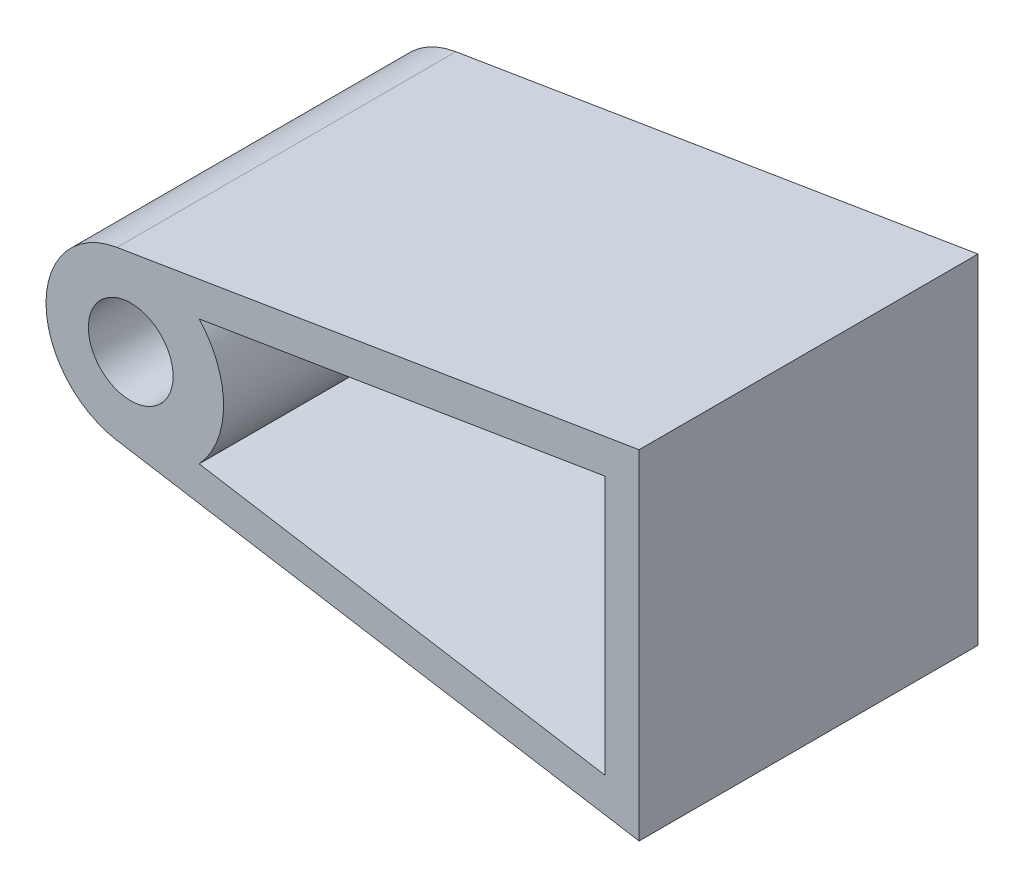
ISO-10303-21;
HEADER;
FILE_DESCRIPTION(('STEP AP214'),'2;1');
FILE_NAME('part.step','',(''),(''),'','','');
FILE_SCHEMA(('AUTOMOTIVE_DESIGN { 1 0 10303 214 1 1 1 1 }'));
ENDSEC;
DATA;
#1=APPLICATION_CONTEXT('core data for automotive mechanical design processes');
#2=APPLICATION_PROTOCOL_DEFINITION('international standard','automotive_design',2000,#1);
#3=PRODUCT_CONTEXT('',#1,'mechanical');
#4=PRODUCT('Part','Part','',(#3));
#5=PRODUCT_RELATED_PRODUCT_CATEGORY('part','',(#4));
#6=PRODUCT_DEFINITION_FORMATION('','',#4);
#7=PRODUCT_DEFINITION_CONTEXT('part definition',#1,'design');
#8=PRODUCT_DEFINITION('design','',#6,#7);
#9=PRODUCT_DEFINITION_SHAPE('','',#8);
#10=(LENGTH_UNIT() NAMED_UNIT(*) SI_UNIT(.MILLI.,.METRE.));
#11=(NAMED_UNIT(*) PLANE_ANGLE_UNIT() SI_UNIT($,.RADIAN.));
#12=(NAMED_UNIT(*) SI_UNIT($,.STERADIAN.) SOLID_ANGLE_UNIT());
#13=UNCERTAINTY_MEASURE_WITH_UNIT(LENGTH_MEASURE(1.E-05),#10,'distance_accuracy_value','');
#14=(GEOMETRIC_REPRESENTATION_CONTEXT(3) GLOBAL_UNCERTAINTY_ASSIGNED_CONTEXT((#13)) GLOBAL_UNIT_ASSIGNED_CONTEXT((#10,
#11,#12)) REPRESENTATION_CONTEXT('',''));
#15=CARTESIAN_POINT('',(0.,0.,0.));
#16=DIRECTION('',(0.,0.,1.));
#17=DIRECTION('',(1.,0.,0.));
#18=AXIS2_PLACEMENT_3D('',#15,#16,#17);
#19=CARTESIAN_POINT('',(-30.,0.,10.));
#20=DIRECTION('',(0.,0.,1.));
#21=DIRECTION('',(1.,0.,0.));
#22=AXIS2_PLACEMENT_3D('',#19,#20,#21);
#23=PLANE('',#22);
#24=CARTESIAN_POINT('',(-30.,0.,10.));
#25=DIRECTION('',(0.,0.,-1.));
#26=DIRECTION('',(1.,0.,0.));
#27=AXIS2_PLACEMENT_3D('',#24,#25,#26);
#28=CIRCLE('',#27,5.48071976405732);
#29=CARTESIAN_POINT('',(-25.9607740547666,3.7044490677403,10.));
#30=VERTEX_POINT('',#29);
#31=CARTESIAN_POINT('',(-25.9607740547666,-3.7044490677403,10.));
#32=VERTEX_POINT('',#31);
#33=EDGE_CURVE('E54',#30,#32,#28,.T.);
#34=ORIENTED_EDGE('',*,*,#33,.F.);
#35=DIRECTION('',(-0.98674969975976,-0.16224989991992,0.));
#36=VECTOR('',#35,1.);
#37=CARTESIAN_POINT('',(-2.,7.64428628617189,10.));
#38=LINE('',#37,#36);
#39=CARTESIAN_POINT('',(-2.,7.64428628617189,10.));
#40=VERTEX_POINT('',#39);
#41=EDGE_CURVE('E125',#40,#30,#38,.T.);
#42=ORIENTED_EDGE('',*,*,#41,.F.);
#43=DIRECTION('',(0.,1.,0.));
#44=VECTOR('',#43,1.);
#45=CARTESIAN_POINT('',(-2.,-7.64428628617189,10.));
#46=LINE('',#45,#44);
#47=CARTESIAN_POINT('',(-2.,-7.64428628617189,10.));
#48=VERTEX_POINT('',#47);
#49=EDGE_CURVE('E129',#48,#40,#46,.T.);
#50=ORIENTED_EDGE('',*,*,#49,.F.);
#51=DIRECTION('',(0.98674969975976,-0.16224989991992,0.));
#52=VECTOR('',#51,1.);
#53=CARTESIAN_POINT('',(-25.9607740547666,-3.7044490677403,10.));
#54=LINE('',#53,#52);
#55=EDGE_CURVE('E138',#32,#48,#54,.T.);
#56=ORIENTED_EDGE('',*,*,#55,.F.);
#57=EDGE_LOOP('',(#34,#42,#50,#56));
#58=FACE_BOUND('',#57,.T.);
#59=DIRECTION('',(0.98674969975976,-0.16224989991992,0.));
#60=VECTOR('',#59,1.);
#61=CARTESIAN_POINT('',(0.,-10.,10.));
#62=LINE('',#61,#60);
#63=CARTESIAN_POINT('',(-30.8112494995996,-4.9337484987988,10.));
#64=VERTEX_POINT('',#63);
#65=CARTESIAN_POINT('',(0.,-10.,10.));
#66=VERTEX_POINT('',#65);
#67=EDGE_CURVE('E161',#64,#66,#62,.T.);
#68=ORIENTED_EDGE('',*,*,#67,.T.);
#69=DIRECTION('',(0.,1.,0.));
#70=VECTOR('',#69,1.);
#71=CARTESIAN_POINT('',(0.,10.,10.));
#72=LINE('',#71,#70);
#73=CARTESIAN_POINT('',(0.,10.,10.));
#74=VERTEX_POINT('',#73);
#75=EDGE_CURVE('E165',#66,#74,#72,.T.);
#76=ORIENTED_EDGE('',*,*,#75,.T.);
#77=DIRECTION('',(-0.98674969975976,-0.16224989991992,0.));
#78=VECTOR('',#77,1.);
#79=CARTESIAN_POINT('',(0.,10.,10.));
#80=LINE('',#79,#78);
#81=CARTESIAN_POINT('',(-30.8112494995996,4.9337484987988,10.));
#82=VERTEX_POINT('',#81);
#83=EDGE_CURVE('E169',#74,#82,#80,.T.);
#84=ORIENTED_EDGE('',*,*,#83,.T.);
#85=CARTESIAN_POINT('',(-30.,0.,10.));
#86=DIRECTION('',(0.,0.,1.));
#87=DIRECTION('',(1.,0.,0.));
#88=AXIS2_PLACEMENT_3D('',#85,#86,#87);
#89=CIRCLE('',#88,5.);
#90=EDGE_CURVE('E172',#82,#64,#89,.T.);
#91=ORIENTED_EDGE('',*,*,#90,.T.);
#92=EDGE_LOOP('',(#68,#76,#84,#91));
#93=FACE_BOUND('',#92,.T.);
#94=CARTESIAN_POINT('',(-30.,0.,10.));
#95=DIRECTION('',(0.,0.,1.));
#96=DIRECTION('',(1.,0.,0.));
#97=AXIS2_PLACEMENT_3D('',#94,#95,#96);
#98=CIRCLE('',#97,2.5);
#99=CARTESIAN_POINT('',(-27.5,0.,10.));
#100=VERTEX_POINT('',#99);
#101=EDGE_CURVE('E153',#100,#100,#98,.T.);
#102=ORIENTED_EDGE('',*,*,#101,.F.);
#103=EDGE_LOOP('',(#102));
#104=FACE_BOUND('',#103,.T.);
#105=ADVANCED_FACE('F38',(#58,#93,#104),#23,.T.);
#106=CARTESIAN_POINT('',(-30.,0.,-10.));
#107=DIRECTION('',(0.,0.,1.));
#108=DIRECTION('',(1.,0.,0.));
#109=AXIS2_PLACEMENT_3D('',#106,#107,#108);
#110=PLANE('',#109);
#111=DIRECTION('',(-0.98674969975976,-0.16224989991992,0.));
#112=VECTOR('',#111,1.);
#113=CARTESIAN_POINT('',(-2.,7.64428628617189,-10.));
#114=LINE('',#113,#112);
#115=CARTESIAN_POINT('',(-2.,7.64428628617189,-10.));
#116=VERTEX_POINT('',#115);
#117=CARTESIAN_POINT('',(-25.9607740547666,3.7044490677403,-10.));
#118=VERTEX_POINT('',#117);
#119=EDGE_CURVE('E113',#116,#118,#114,.T.);
#120=ORIENTED_EDGE('',*,*,#119,.T.);
#121=CARTESIAN_POINT('',(-30.,0.,-10.));
#122=DIRECTION('',(0.,0.,-1.));
#123=DIRECTION('',(1.,0.,0.));
#124=AXIS2_PLACEMENT_3D('',#121,#122,#123);
#125=CIRCLE('',#124,5.48071976405732);
#126=CARTESIAN_POINT('',(-25.9607740547666,-3.7044490677403,-10.));
#127=VERTEX_POINT('',#126);
#128=EDGE_CURVE('E106',#118,#127,#125,.T.);
#129=ORIENTED_EDGE('',*,*,#128,.T.);
#130=DIRECTION('',(0.98674969975976,-0.16224989991992,0.));
#131=VECTOR('',#130,1.);
#132=CARTESIAN_POINT('',(-25.9607740547666,-3.7044490677403,-10.));
#133=LINE('',#132,#131);
#134=CARTESIAN_POINT('',(-2.,-7.64428628617188,-10.));
#135=VERTEX_POINT('',#134);
#136=EDGE_CURVE('E116',#127,#135,#133,.T.);
#137=ORIENTED_EDGE('',*,*,#136,.T.);
#138=DIRECTION('',(0.,1.,0.));
#139=VECTOR('',#138,1.);
#140=CARTESIAN_POINT('',(-2.,-7.64428628617189,-10.));
#141=LINE('',#140,#139);
#142=EDGE_CURVE('E62',#135,#116,#141,.T.);
#143=ORIENTED_EDGE('',*,*,#142,.T.);
#144=EDGE_LOOP('',(#120,#129,#137,#143));
#145=FACE_BOUND('',#144,.T.);
#146=DIRECTION('',(0.98674969975976,-0.16224989991992,0.));
#147=VECTOR('',#146,1.);
#148=CARTESIAN_POINT('',(0.,-10.,-10.));
#149=LINE('',#148,#147);
#150=CARTESIAN_POINT('',(-30.8112494995996,-4.9337484987988,-10.));
#151=VERTEX_POINT('',#150);
#152=CARTESIAN_POINT('',(0.,-10.,-10.));
#153=VERTEX_POINT('',#152);
#154=EDGE_CURVE('E157',#151,#153,#149,.T.);
#155=ORIENTED_EDGE('',*,*,#154,.F.);
#156=CARTESIAN_POINT('',(-30.,0.,-10.));
#157=DIRECTION('',(0.,0.,1.));
#158=DIRECTION('',(1.,0.,0.));
#159=AXIS2_PLACEMENT_3D('',#156,#157,#158);
#160=CIRCLE('',#159,5.);
#161=CARTESIAN_POINT('',(-30.8112494995996,4.9337484987988,-10.));
#162=VERTEX_POINT('',#161);
#163=EDGE_CURVE('E166',#162,#151,#160,.T.);
#164=ORIENTED_EDGE('',*,*,#163,.F.);
#165=DIRECTION('',(-0.98674969975976,-0.16224989991992,0.));
#166=VECTOR('',#165,1.);
#167=CARTESIAN_POINT('',(0.,10.,-10.));
#168=LINE('',#167,#166);
#169=CARTESIAN_POINT('',(0.,10.,-10.));
#170=VERTEX_POINT('',#169);
#171=EDGE_CURVE('E182',#170,#162,#168,.T.);
#172=ORIENTED_EDGE('',*,*,#171,.F.);
#173=DIRECTION('',(0.,1.,0.));
#174=VECTOR('',#173,1.);
#175=CARTESIAN_POINT('',(0.,10.,-10.));
#176=LINE('',#175,#174);
#177=EDGE_CURVE('E179',#153,#170,#176,.T.);
#178=ORIENTED_EDGE('',*,*,#177,.F.);
#179=EDGE_LOOP('',(#155,#164,#172,#178));
#180=FACE_BOUND('',#179,.T.);
#181=CARTESIAN_POINT('',(-30.,0.,-10.));
#182=DIRECTION('',(0.,0.,1.));
#183=DIRECTION('',(1.,0.,0.));
#184=AXIS2_PLACEMENT_3D('',#181,#182,#183);
#185=CIRCLE('',#184,2.5);
#186=CARTESIAN_POINT('',(-27.5,0.,-10.));
#187=VERTEX_POINT('',#186);
#188=EDGE_CURVE('E147',#187,#187,#185,.T.);
#189=ORIENTED_EDGE('',*,*,#188,.T.);
#190=EDGE_LOOP('',(#189));
#191=FACE_BOUND('',#190,.T.);
#192=ADVANCED_FACE('F121',(#145,#180,#191),#110,.F.);
#193=CARTESIAN_POINT('',(0.,-10.,10.));
#194=DIRECTION('',(0.16224989991992,0.98674969975976,0.));
#195=DIRECTION('',(-0.98674969975976,0.16224989991992,0.));
#196=AXIS2_PLACEMENT_3D('',#193,#194,#195);
#197=PLANE('',#196);
#198=ORIENTED_EDGE('',*,*,#154,.T.);
#199=DIRECTION('',(0.,0.,-1.));
#200=VECTOR('',#199,1.);
#201=CARTESIAN_POINT('',(0.,-10.,10.));
#202=LINE('',#201,#200);
#203=EDGE_CURVE('E11',#66,#153,#202,.T.);
#204=ORIENTED_EDGE('',*,*,#203,.F.);
#205=ORIENTED_EDGE('',*,*,#67,.F.);
#206=DIRECTION('',(0.,0.,-1.));
#207=VECTOR('',#206,1.);
#208=CARTESIAN_POINT('',(-30.8112494995996,-4.9337484987988,10.));
#209=LINE('',#208,#207);
#210=EDGE_CURVE('E175',#64,#151,#209,.T.);
#211=ORIENTED_EDGE('',*,*,#210,.T.);
#212=EDGE_LOOP('',(#198,#204,#205,#211));
#213=FACE_BOUND('',#212,.T.);
#214=ADVANCED_FACE('F40',(#213),#197,.F.);
#215=CARTESIAN_POINT('',(0.,10.,10.));
#216=DIRECTION('',(-1.,0.,0.));
#217=DIRECTION('',(0.,0.,1.));
#218=AXIS2_PLACEMENT_3D('',#215,#216,#217);
#219=PLANE('',#218);
#220=ORIENTED_EDGE('',*,*,#177,.T.);
#221=DIRECTION('',(0.,0.,-1.));
#222=VECTOR('',#221,1.);
#223=CARTESIAN_POINT('',(0.,10.,10.));
#224=LINE('',#223,#222);
#225=EDGE_CURVE('E47',#74,#170,#224,.T.);
#226=ORIENTED_EDGE('',*,*,#225,.F.);
#227=ORIENTED_EDGE('',*,*,#75,.F.);
#228=ORIENTED_EDGE('',*,*,#203,.T.);
#229=EDGE_LOOP('',(#220,#226,#227,#228));
#230=FACE_BOUND('',#229,.T.);
#231=ADVANCED_FACE('F214',(#230),#219,.F.);
#232=CARTESIAN_POINT('',(0.,10.,10.));
#233=DIRECTION('',(0.16224989991992,-0.98674969975976,0.));
#234=DIRECTION('',(0.98674969975976,0.16224989991992,0.));
#235=AXIS2_PLACEMENT_3D('',#232,#233,#234);
#236=PLANE('',#235);
#237=ORIENTED_EDGE('',*,*,#171,.T.);
#238=DIRECTION('',(0.,0.,-1.));
#239=VECTOR('',#238,1.);
#240=CARTESIAN_POINT('',(-30.8112494995996,4.9337484987988,10.));
#241=LINE('',#240,#239);
#242=EDGE_CURVE('E190',#82,#162,#241,.T.);
#243=ORIENTED_EDGE('',*,*,#242,.F.);
#244=ORIENTED_EDGE('',*,*,#83,.F.);
#245=ORIENTED_EDGE('',*,*,#225,.T.);
#246=EDGE_LOOP('',(#237,#243,#244,#245));
#247=FACE_BOUND('',#246,.T.);
#248=ADVANCED_FACE('F199',(#247),#236,.F.);
#249=CARTESIAN_POINT('',(-30.,0.,10.));
#250=DIRECTION('',(0.,0.,-1.));
#251=DIRECTION('',(-1.,0.,0.));
#252=AXIS2_PLACEMENT_3D('',#249,#250,#251);
#253=CYLINDRICAL_SURFACE('',#252,5.);
#254=ORIENTED_EDGE('',*,*,#163,.T.);
#255=ORIENTED_EDGE('',*,*,#210,.F.);
#256=ORIENTED_EDGE('',*,*,#90,.F.);
#257=ORIENTED_EDGE('',*,*,#242,.T.);
#258=EDGE_LOOP('',(#254,#255,#256,#257));
#259=FACE_BOUND('',#258,.T.);
#260=ADVANCED_FACE('F207',(#259),#253,.T.);
#261=CARTESIAN_POINT('',(-30.,0.,10.));
#262=DIRECTION('',(0.,0.,-1.));
#263=DIRECTION('',(-1.,0.,0.));
#264=AXIS2_PLACEMENT_3D('',#261,#262,#263);
#265=CYLINDRICAL_SURFACE('',#264,2.5);
#266=ORIENTED_EDGE('',*,*,#101,.T.);
#267=EDGE_LOOP('',(#266));
#268=FACE_BOUND('',#267,.T.);
#269=ORIENTED_EDGE('',*,*,#188,.F.);
#270=EDGE_LOOP('',(#269));
#271=FACE_BOUND('',#270,.T.);
#272=ADVANCED_FACE('F230',(#268,#271),#265,.F.);
#273=CARTESIAN_POINT('',(-30.,0.,-10.));
#274=DIRECTION('',(0.,0.,1.));
#275=DIRECTION('',(1.,0.,0.));
#276=AXIS2_PLACEMENT_3D('',#273,#274,#275);
#277=CYLINDRICAL_SURFACE('',#276,5.48071976405732);
#278=ORIENTED_EDGE('',*,*,#33,.T.);
#279=DIRECTION('',(0.,0.,1.));
#280=VECTOR('',#279,1.);
#281=CARTESIAN_POINT('',(-25.9607740547666,-3.7044490677403,-10.));
#282=LINE('',#281,#280);
#283=EDGE_CURVE('E102',#127,#32,#282,.T.);
#284=ORIENTED_EDGE('',*,*,#283,.F.);
#285=ORIENTED_EDGE('',*,*,#128,.F.);
#286=DIRECTION('',(0.,0.,1.));
#287=VECTOR('',#286,1.);
#288=CARTESIAN_POINT('',(-25.9607740547666,3.7044490677403,-10.));
#289=LINE('',#288,#287);
#290=EDGE_CURVE('E144',#118,#30,#289,.T.);
#291=ORIENTED_EDGE('',*,*,#290,.T.);
#292=EDGE_LOOP('',(#278,#284,#285,#291));
#293=FACE_BOUND('',#292,.T.);
#294=ADVANCED_FACE('F104',(#293),#277,.T.);
#295=CARTESIAN_POINT('',(-2.,7.64428628617189,-10.));
#296=DIRECTION('',(-0.16224989991992,0.98674969975976,0.));
#297=DIRECTION('',(-0.98674969975976,-0.16224989991992,0.));
#298=AXIS2_PLACEMENT_3D('',#295,#296,#297);
#299=PLANE('',#298);
#300=ORIENTED_EDGE('',*,*,#41,.T.);
#301=ORIENTED_EDGE('',*,*,#290,.F.);
#302=ORIENTED_EDGE('',*,*,#119,.F.);
#303=DIRECTION('',(0.,0.,1.));
#304=VECTOR('',#303,1.);
#305=CARTESIAN_POINT('',(-2.,7.64428628617189,-10.));
#306=LINE('',#305,#304);
#307=EDGE_CURVE('E148',#116,#40,#306,.T.);
#308=ORIENTED_EDGE('',*,*,#307,.T.);
#309=EDGE_LOOP('',(#300,#301,#302,#308));
#310=FACE_BOUND('',#309,.T.);
#311=ADVANCED_FACE('F240',(#310),#299,.F.);
#312=CARTESIAN_POINT('',(-2.,-7.64428628617189,-10.));
#313=DIRECTION('',(1.,0.,0.));
#314=DIRECTION('',(0.,0.,-1.));
#315=AXIS2_PLACEMENT_3D('',#312,#313,#314);
#316=PLANE('',#315);
#317=ORIENTED_EDGE('',*,*,#49,.T.);
#318=ORIENTED_EDGE('',*,*,#307,.F.);
#319=ORIENTED_EDGE('',*,*,#142,.F.);
#320=DIRECTION('',(0.,0.,1.));
#321=VECTOR('',#320,1.);
#322=CARTESIAN_POINT('',(-2.,-7.64428628617189,-10.));
#323=LINE('',#322,#321);
#324=EDGE_CURVE('E112',#135,#48,#323,.T.);
#325=ORIENTED_EDGE('',*,*,#324,.T.);
#326=EDGE_LOOP('',(#317,#318,#319,#325));
#327=FACE_BOUND('',#326,.T.);
#328=ADVANCED_FACE('F247',(#327),#316,.F.);
#329=CARTESIAN_POINT('',(-25.9607740547666,-3.7044490677403,-10.));
#330=DIRECTION('',(-0.16224989991992,-0.98674969975976,0.));
#331=DIRECTION('',(0.98674969975976,-0.16224989991992,0.));
#332=AXIS2_PLACEMENT_3D('',#329,#330,#331);
#333=PLANE('',#332);
#334=ORIENTED_EDGE('',*,*,#55,.T.);
#335=ORIENTED_EDGE('',*,*,#324,.F.);
#336=ORIENTED_EDGE('',*,*,#136,.F.);
#337=ORIENTED_EDGE('',*,*,#283,.T.);
#338=EDGE_LOOP('',(#334,#335,#336,#337));
#339=FACE_BOUND('',#338,.T.);
#340=ADVANCED_FACE('F117',(#339),#333,.F.);
#341=CLOSED_SHELL('',(#105,#192,#214,#231,#248,#260,#272,#294,#311,#328,#340));
#342=MANIFOLD_SOLID_BREP('B2',#341);
#343=ADVANCED_BREP_SHAPE_REPRESENTATION('',(#18,#342),#14);
#344=SHAPE_DEFINITION_REPRESENTATION(#9,#343);
ENDSEC;
END-ISO-10303-21;
